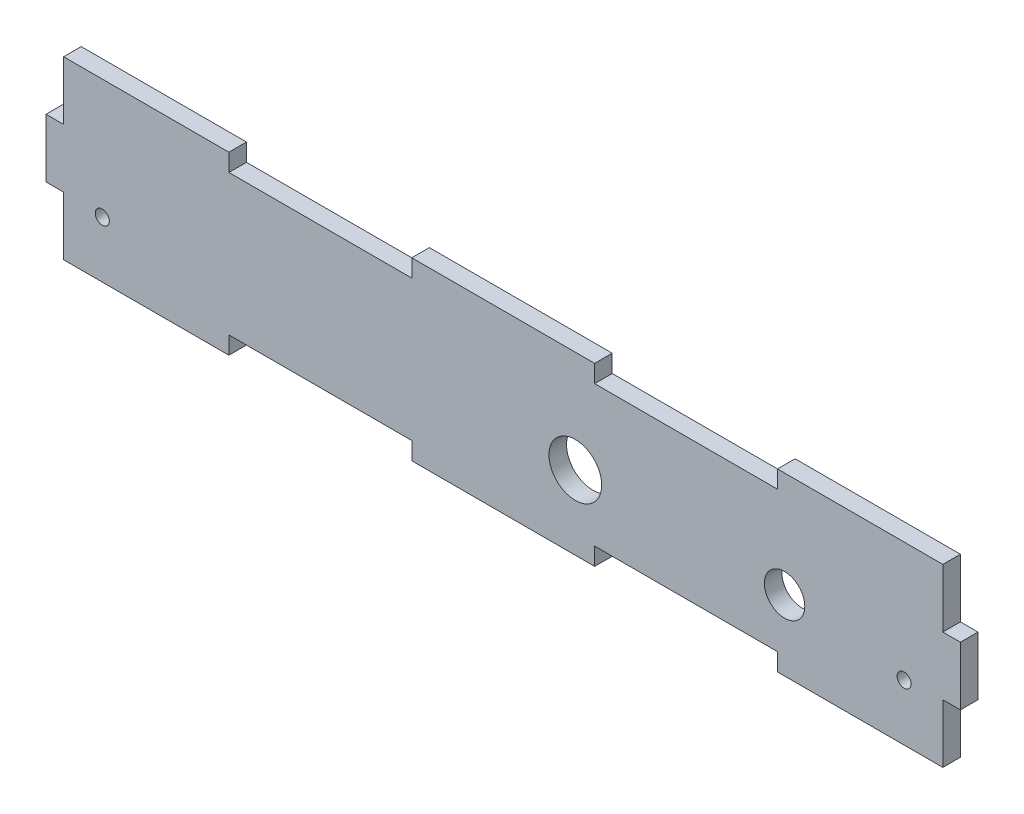
ISO-10303-21;
HEADER;
FILE_DESCRIPTION(('STEP AP214'),'2;1');
FILE_NAME('part.step','',(''),(''),'','','');
FILE_SCHEMA(('AUTOMOTIVE_DESIGN { 1 0 10303 214 1 1 1 1 }'));
ENDSEC;
DATA;
#1=APPLICATION_CONTEXT('core data for automotive mechanical design processes');
#2=APPLICATION_PROTOCOL_DEFINITION('international standard','automotive_design',2000,#1);
#3=PRODUCT_CONTEXT('',#1,'mechanical');
#4=PRODUCT('Part','Part','',(#3));
#5=PRODUCT_RELATED_PRODUCT_CATEGORY('part','',(#4));
#6=PRODUCT_DEFINITION_FORMATION('','',#4);
#7=PRODUCT_DEFINITION_CONTEXT('part definition',#1,'design');
#8=PRODUCT_DEFINITION('design','',#6,#7);
#9=PRODUCT_DEFINITION_SHAPE('','',#8);
#10=(LENGTH_UNIT() NAMED_UNIT(*) SI_UNIT(.MILLI.,.METRE.));
#11=(NAMED_UNIT(*) PLANE_ANGLE_UNIT() SI_UNIT($,.RADIAN.));
#12=(NAMED_UNIT(*) SI_UNIT($,.STERADIAN.) SOLID_ANGLE_UNIT());
#13=UNCERTAINTY_MEASURE_WITH_UNIT(LENGTH_MEASURE(1.E-05),#10,'distance_accuracy_value','');
#14=(GEOMETRIC_REPRESENTATION_CONTEXT(3) GLOBAL_UNCERTAINTY_ASSIGNED_CONTEXT((#13)) GLOBAL_UNIT_ASSIGNED_CONTEXT((#10,
#11,#12)) REPRESENTATION_CONTEXT('',''));
#15=CARTESIAN_POINT('',(0.,0.,0.));
#16=DIRECTION('',(0.,0.,1.));
#17=DIRECTION('',(1.,0.,0.));
#18=AXIS2_PLACEMENT_3D('',#15,#16,#17);
#19=CARTESIAN_POINT('',(0.,0.,5.));
#20=DIRECTION('',(0.,0.,-1.));
#21=DIRECTION('',(-1.,0.,0.));
#22=AXIS2_PLACEMENT_3D('',#19,#20,#21);
#23=PLANE('',#22);
#24=CARTESIAN_POINT('',(210.,20.,5.));
#25=DIRECTION('',(0.,0.,1.));
#26=DIRECTION('',(1.,0.,0.));
#27=AXIS2_PLACEMENT_3D('',#24,#25,#26);
#28=CIRCLE('',#27,5.75);
#29=CARTESIAN_POINT('',(215.75,20.,5.));
#30=VERTEX_POINT('',#29);
#31=EDGE_CURVE('E381',#30,#30,#28,.T.);
#32=ORIENTED_EDGE('',*,*,#31,.F.);
#33=EDGE_LOOP('',(#32));
#34=FACE_BOUND('',#33,.T.);
#35=CARTESIAN_POINT('',(150.5,21.,5.));
#36=DIRECTION('',(0.,0.,1.));
#37=DIRECTION('',(1.,0.,0.));
#38=AXIS2_PLACEMENT_3D('',#35,#36,#37);
#39=CIRCLE('',#38,7.50000000000001);
#40=CARTESIAN_POINT('',(158.,21.,5.));
#41=VERTEX_POINT('',#40);
#42=EDGE_CURVE('E387',#41,#41,#39,.T.);
#43=ORIENTED_EDGE('',*,*,#42,.F.);
#44=EDGE_LOOP('',(#43));
#45=FACE_BOUND('',#44,.T.);
#46=DIRECTION('',(0.,1.,0.));
#47=VECTOR('',#46,1.);
#48=CARTESIAN_POINT('',(52.,0.,5.));
#49=LINE('',#48,#47);
#50=CARTESIAN_POINT('',(52.,0.,5.));
#51=VERTEX_POINT('',#50);
#52=CARTESIAN_POINT('',(52.,5.,5.));
#53=VERTEX_POINT('',#52);
#54=EDGE_CURVE('E308',#51,#53,#49,.T.);
#55=ORIENTED_EDGE('',*,*,#54,.T.);
#56=DIRECTION('',(1.,0.,0.));
#57=VECTOR('',#56,1.);
#58=CARTESIAN_POINT('',(52.,5.,5.));
#59=LINE('',#58,#57);
#60=CARTESIAN_POINT('',(104.,5.,5.));
#61=VERTEX_POINT('',#60);
#62=EDGE_CURVE('E156',#53,#61,#59,.T.);
#63=ORIENTED_EDGE('',*,*,#62,.T.);
#64=DIRECTION('',(0.,-1.,0.));
#65=VECTOR('',#64,1.);
#66=CARTESIAN_POINT('',(104.,5.,5.));
#67=LINE('',#66,#65);
#68=CARTESIAN_POINT('',(104.,0.,5.));
#69=VERTEX_POINT('',#68);
#70=EDGE_CURVE('E406',#61,#69,#67,.T.);
#71=ORIENTED_EDGE('',*,*,#70,.T.);
#72=DIRECTION('',(1.,0.,0.));
#73=VECTOR('',#72,1.);
#74=CARTESIAN_POINT('',(104.,0.,5.));
#75=LINE('',#74,#73);
#76=CARTESIAN_POINT('',(156.,0.,5.));
#77=VERTEX_POINT('',#76);
#78=EDGE_CURVE('E408',#69,#77,#75,.T.);
#79=ORIENTED_EDGE('',*,*,#78,.T.);
#80=DIRECTION('',(0.,1.,0.));
#81=VECTOR('',#80,1.);
#82=CARTESIAN_POINT('',(156.,5.00000000000001,5.));
#83=LINE('',#82,#81);
#84=CARTESIAN_POINT('',(156.,5.00000000000001,5.));
#85=VERTEX_POINT('',#84);
#86=EDGE_CURVE('E410',#77,#85,#83,.T.);
#87=ORIENTED_EDGE('',*,*,#86,.T.);
#88=DIRECTION('',(1.,0.,0.));
#89=VECTOR('',#88,1.);
#90=CARTESIAN_POINT('',(208.,5.00000000000002,5.));
#91=LINE('',#90,#89);
#92=CARTESIAN_POINT('',(208.,5.00000000000002,5.));
#93=VERTEX_POINT('',#92);
#94=EDGE_CURVE('E412',#85,#93,#91,.T.);
#95=ORIENTED_EDGE('',*,*,#94,.T.);
#96=DIRECTION('',(0.,-1.,0.));
#97=VECTOR('',#96,1.);
#98=CARTESIAN_POINT('',(208.,0.,5.));
#99=LINE('',#98,#97);
#100=CARTESIAN_POINT('',(208.,0.,5.));
#101=VERTEX_POINT('',#100);
#102=EDGE_CURVE('E414',#93,#101,#99,.T.);
#103=ORIENTED_EDGE('',*,*,#102,.T.);
#104=DIRECTION('',(1.,0.,0.));
#105=VECTOR('',#104,1.);
#106=CARTESIAN_POINT('',(208.,0.,5.));
#107=LINE('',#106,#105);
#108=CARTESIAN_POINT('',(255.,0.,5.));
#109=VERTEX_POINT('',#108);
#110=EDGE_CURVE('E416',#101,#109,#107,.T.);
#111=ORIENTED_EDGE('',*,*,#110,.T.);
#112=DIRECTION('',(0.,1.,0.));
#113=VECTOR('',#112,1.);
#114=CARTESIAN_POINT('',(255.,16.6666666666667,5.));
#115=LINE('',#114,#113);
#116=CARTESIAN_POINT('',(255.,16.6666666666667,5.));
#117=VERTEX_POINT('',#116);
#118=EDGE_CURVE('E418',#109,#117,#115,.T.);
#119=ORIENTED_EDGE('',*,*,#118,.T.);
#120=DIRECTION('',(1.,0.,0.));
#121=VECTOR('',#120,1.);
#122=CARTESIAN_POINT('',(255.,16.6666666666667,5.));
#123=LINE('',#122,#121);
#124=CARTESIAN_POINT('',(260.,16.6666666666667,5.));
#125=VERTEX_POINT('',#124);
#126=EDGE_CURVE('E420',#117,#125,#123,.T.);
#127=ORIENTED_EDGE('',*,*,#126,.T.);
#128=DIRECTION('',(0.,1.,0.));
#129=VECTOR('',#128,1.);
#130=CARTESIAN_POINT('',(260.,16.6666666666667,5.));
#131=LINE('',#130,#129);
#132=CARTESIAN_POINT('',(260.,33.3333333333333,5.));
#133=VERTEX_POINT('',#132);
#134=EDGE_CURVE('E422',#125,#133,#131,.T.);
#135=ORIENTED_EDGE('',*,*,#134,.T.);
#136=DIRECTION('',(-1.,0.,0.));
#137=VECTOR('',#136,1.);
#138=CARTESIAN_POINT('',(260.,33.3333333333333,5.));
#139=LINE('',#138,#137);
#140=CARTESIAN_POINT('',(255.,33.3333333333333,5.));
#141=VERTEX_POINT('',#140);
#142=EDGE_CURVE('E424',#133,#141,#139,.T.);
#143=ORIENTED_EDGE('',*,*,#142,.T.);
#144=DIRECTION('',(0.,1.,0.));
#145=VECTOR('',#144,1.);
#146=CARTESIAN_POINT('',(255.,33.3333333333333,5.));
#147=LINE('',#146,#145);
#148=CARTESIAN_POINT('',(255.,50.,5.));
#149=VERTEX_POINT('',#148);
#150=EDGE_CURVE('E426',#141,#149,#147,.T.);
#151=ORIENTED_EDGE('',*,*,#150,.T.);
#152=DIRECTION('',(-1.,0.,0.));
#153=VECTOR('',#152,1.);
#154=CARTESIAN_POINT('',(208.,50.,5.));
#155=LINE('',#154,#153);
#156=CARTESIAN_POINT('',(208.,50.,5.));
#157=VERTEX_POINT('',#156);
#158=EDGE_CURVE('E428',#149,#157,#155,.T.);
#159=ORIENTED_EDGE('',*,*,#158,.T.);
#160=DIRECTION('',(0.,-1.,0.));
#161=VECTOR('',#160,1.);
#162=CARTESIAN_POINT('',(208.,50.,5.));
#163=LINE('',#162,#161);
#164=CARTESIAN_POINT('',(208.,45.,5.));
#165=VERTEX_POINT('',#164);
#166=EDGE_CURVE('E430',#157,#165,#163,.T.);
#167=ORIENTED_EDGE('',*,*,#166,.T.);
#168=DIRECTION('',(-1.,0.,0.));
#169=VECTOR('',#168,1.);
#170=CARTESIAN_POINT('',(208.,45.,5.));
#171=LINE('',#170,#169);
#172=CARTESIAN_POINT('',(156.,45.,5.));
#173=VERTEX_POINT('',#172);
#174=EDGE_CURVE('E432',#165,#173,#171,.T.);
#175=ORIENTED_EDGE('',*,*,#174,.T.);
#176=DIRECTION('',(0.,1.,0.));
#177=VECTOR('',#176,1.);
#178=CARTESIAN_POINT('',(156.,45.,5.));
#179=LINE('',#178,#177);
#180=CARTESIAN_POINT('',(156.,50.,5.));
#181=VERTEX_POINT('',#180);
#182=EDGE_CURVE('E434',#173,#181,#179,.T.);
#183=ORIENTED_EDGE('',*,*,#182,.T.);
#184=DIRECTION('',(-1.,0.,0.));
#185=VECTOR('',#184,1.);
#186=CARTESIAN_POINT('',(104.,50.,5.));
#187=LINE('',#186,#185);
#188=CARTESIAN_POINT('',(104.,50.,5.));
#189=VERTEX_POINT('',#188);
#190=EDGE_CURVE('E436',#181,#189,#187,.T.);
#191=ORIENTED_EDGE('',*,*,#190,.T.);
#192=DIRECTION('',(0.,-1.,0.));
#193=VECTOR('',#192,1.);
#194=CARTESIAN_POINT('',(104.,45.,5.));
#195=LINE('',#194,#193);
#196=CARTESIAN_POINT('',(104.,45.,5.));
#197=VERTEX_POINT('',#196);
#198=EDGE_CURVE('E438',#189,#197,#195,.T.);
#199=ORIENTED_EDGE('',*,*,#198,.T.);
#200=DIRECTION('',(-1.,0.,0.));
#201=VECTOR('',#200,1.);
#202=CARTESIAN_POINT('',(52.,45.,5.));
#203=LINE('',#202,#201);
#204=CARTESIAN_POINT('',(52.,45.,5.));
#205=VERTEX_POINT('',#204);
#206=EDGE_CURVE('E440',#197,#205,#203,.T.);
#207=ORIENTED_EDGE('',*,*,#206,.T.);
#208=DIRECTION('',(0.,1.,0.));
#209=VECTOR('',#208,1.);
#210=CARTESIAN_POINT('',(52.,50.,5.));
#211=LINE('',#210,#209);
#212=CARTESIAN_POINT('',(52.,50.,5.));
#213=VERTEX_POINT('',#212);
#214=EDGE_CURVE('E442',#205,#213,#211,.T.);
#215=ORIENTED_EDGE('',*,*,#214,.T.);
#216=DIRECTION('',(-1.,0.,0.));
#217=VECTOR('',#216,1.);
#218=CARTESIAN_POINT('',(5.,50.,5.));
#219=LINE('',#218,#217);
#220=CARTESIAN_POINT('',(5.,50.,5.));
#221=VERTEX_POINT('',#220);
#222=EDGE_CURVE('E444',#213,#221,#219,.T.);
#223=ORIENTED_EDGE('',*,*,#222,.T.);
#224=DIRECTION('',(0.,-1.,0.));
#225=VECTOR('',#224,1.);
#226=CARTESIAN_POINT('',(5.,33.3333333333333,5.));
#227=LINE('',#226,#225);
#228=CARTESIAN_POINT('',(5.,33.3333333333333,5.));
#229=VERTEX_POINT('',#228);
#230=EDGE_CURVE('E446',#221,#229,#227,.T.);
#231=ORIENTED_EDGE('',*,*,#230,.T.);
#232=DIRECTION('',(-1.,0.,0.));
#233=VECTOR('',#232,1.);
#234=CARTESIAN_POINT('',(0.,33.3333333333333,5.));
#235=LINE('',#234,#233);
#236=CARTESIAN_POINT('',(0.,33.3333333333333,5.));
#237=VERTEX_POINT('',#236);
#238=EDGE_CURVE('E448',#229,#237,#235,.T.);
#239=ORIENTED_EDGE('',*,*,#238,.T.);
#240=DIRECTION('',(0.,-1.,0.));
#241=VECTOR('',#240,1.);
#242=CARTESIAN_POINT('',(0.,16.6666666666667,5.));
#243=LINE('',#242,#241);
#244=CARTESIAN_POINT('',(0.,16.6666666666667,5.));
#245=VERTEX_POINT('',#244);
#246=EDGE_CURVE('E235',#237,#245,#243,.T.);
#247=ORIENTED_EDGE('',*,*,#246,.T.);
#248=DIRECTION('',(1.,0.,0.));
#249=VECTOR('',#248,1.);
#250=CARTESIAN_POINT('',(5.,16.6666666666667,5.));
#251=LINE('',#250,#249);
#252=CARTESIAN_POINT('',(5.,16.6666666666667,5.));
#253=VERTEX_POINT('',#252);
#254=EDGE_CURVE('E229',#245,#253,#251,.T.);
#255=ORIENTED_EDGE('',*,*,#254,.T.);
#256=DIRECTION('',(0.,-1.,0.));
#257=VECTOR('',#256,1.);
#258=CARTESIAN_POINT('',(5.,16.6666666666667,5.));
#259=LINE('',#258,#257);
#260=CARTESIAN_POINT('',(5.,0.,5.));
#261=VERTEX_POINT('',#260);
#262=EDGE_CURVE('E233',#253,#261,#259,.T.);
#263=ORIENTED_EDGE('',*,*,#262,.T.);
#264=DIRECTION('',(1.,0.,0.));
#265=VECTOR('',#264,1.);
#266=CARTESIAN_POINT('',(5.,0.,5.));
#267=LINE('',#266,#265);
#268=EDGE_CURVE('E53',#261,#51,#267,.T.);
#269=ORIENTED_EDGE('',*,*,#268,.T.);
#270=EDGE_LOOP('',(#55,#63,#71,#79,#87,#95,#103,#111,#119,#127,#135,#143,#151,#159,#167,#175,
#183,#191,#199,#207,#215,#223,#231,#239,#247,#255,#263,#269));
#271=FACE_BOUND('',#270,.T.);
#272=CARTESIAN_POINT('',(16.,16.,5.));
#273=DIRECTION('',(0.,0.,1.));
#274=DIRECTION('',(1.,0.,0.));
#275=AXIS2_PLACEMENT_3D('',#272,#273,#274);
#276=CIRCLE('',#275,2.);
#277=CARTESIAN_POINT('',(18.,16.,5.));
#278=VERTEX_POINT('',#277);
#279=EDGE_CURVE('E257',#278,#278,#276,.T.);
#280=ORIENTED_EDGE('',*,*,#279,.F.);
#281=EDGE_LOOP('',(#280));
#282=FACE_BOUND('',#281,.T.);
#283=CARTESIAN_POINT('',(244.,16.,5.));
#284=DIRECTION('',(0.,0.,1.));
#285=DIRECTION('',(-1.,0.,0.));
#286=AXIS2_PLACEMENT_3D('',#283,#284,#285);
#287=CIRCLE('',#286,2.);
#288=CARTESIAN_POINT('',(242.,16.,5.));
#289=VERTEX_POINT('',#288);
#290=EDGE_CURVE('E394',#289,#289,#287,.T.);
#291=ORIENTED_EDGE('',*,*,#290,.F.);
#292=EDGE_LOOP('',(#291));
#293=FACE_BOUND('',#292,.T.);
#294=ADVANCED_FACE('F34',(#34,#45,#271,#282,#293),#23,.F.);
#295=CARTESIAN_POINT('',(0.,0.,0.));
#296=DIRECTION('',(0.,0.,-1.));
#297=DIRECTION('',(-1.,0.,0.));
#298=AXIS2_PLACEMENT_3D('',#295,#296,#297);
#299=PLANE('',#298);
#300=CARTESIAN_POINT('',(210.,20.,0.));
#301=DIRECTION('',(0.,0.,-1.));
#302=DIRECTION('',(-1.,0.,0.));
#303=AXIS2_PLACEMENT_3D('',#300,#301,#302);
#304=CIRCLE('',#303,5.75);
#305=CARTESIAN_POINT('',(204.25,20.,0.));
#306=VERTEX_POINT('',#305);
#307=EDGE_CURVE('E38',#306,#306,#304,.T.);
#308=ORIENTED_EDGE('',*,*,#307,.F.);
#309=EDGE_LOOP('',(#308));
#310=FACE_BOUND('',#309,.T.);
#311=CARTESIAN_POINT('',(150.5,21.,0.));
#312=DIRECTION('',(0.,0.,-1.));
#313=DIRECTION('',(-1.,0.,0.));
#314=AXIS2_PLACEMENT_3D('',#311,#312,#313);
#315=CIRCLE('',#314,7.50000000000001);
#316=CARTESIAN_POINT('',(143.,21.,0.));
#317=VERTEX_POINT('',#316);
#318=EDGE_CURVE('E379',#317,#317,#315,.T.);
#319=ORIENTED_EDGE('',*,*,#318,.F.);
#320=EDGE_LOOP('',(#319));
#321=FACE_BOUND('',#320,.T.);
#322=CARTESIAN_POINT('',(16.,16.,0.));
#323=DIRECTION('',(0.,0.,1.));
#324=DIRECTION('',(1.,0.,0.));
#325=AXIS2_PLACEMENT_3D('',#322,#323,#324);
#326=CIRCLE('',#325,2.);
#327=CARTESIAN_POINT('',(18.,16.,0.));
#328=VERTEX_POINT('',#327);
#329=EDGE_CURVE('E397',#328,#328,#326,.T.);
#330=ORIENTED_EDGE('',*,*,#329,.T.);
#331=EDGE_LOOP('',(#330));
#332=FACE_BOUND('',#331,.T.);
#333=DIRECTION('',(0.,1.,0.));
#334=VECTOR('',#333,1.);
#335=CARTESIAN_POINT('',(52.,0.,0.));
#336=LINE('',#335,#334);
#337=CARTESIAN_POINT('',(52.,0.,0.));
#338=VERTEX_POINT('',#337);
#339=CARTESIAN_POINT('',(52.,5.,0.));
#340=VERTEX_POINT('',#339);
#341=EDGE_CURVE('E253',#338,#340,#336,.T.);
#342=ORIENTED_EDGE('',*,*,#341,.F.);
#343=DIRECTION('',(1.,0.,0.));
#344=VECTOR('',#343,1.);
#345=CARTESIAN_POINT('',(5.,0.,0.));
#346=LINE('',#345,#344);
#347=CARTESIAN_POINT('',(5.,0.,0.));
#348=VERTEX_POINT('',#347);
#349=EDGE_CURVE('E148',#348,#338,#346,.T.);
#350=ORIENTED_EDGE('',*,*,#349,.F.);
#351=DIRECTION('',(0.,-1.,0.));
#352=VECTOR('',#351,1.);
#353=CARTESIAN_POINT('',(5.,16.6666666666667,0.));
#354=LINE('',#353,#352);
#355=CARTESIAN_POINT('',(5.,16.6666666666667,0.));
#356=VERTEX_POINT('',#355);
#357=EDGE_CURVE('E142',#356,#348,#354,.T.);
#358=ORIENTED_EDGE('',*,*,#357,.F.);
#359=DIRECTION('',(1.,0.,0.));
#360=VECTOR('',#359,1.);
#361=CARTESIAN_POINT('',(5.,16.6666666666667,0.));
#362=LINE('',#361,#360);
#363=CARTESIAN_POINT('',(0.,16.6666666666667,0.));
#364=VERTEX_POINT('',#363);
#365=EDGE_CURVE('E243',#364,#356,#362,.T.);
#366=ORIENTED_EDGE('',*,*,#365,.F.);
#367=DIRECTION('',(0.,-1.,0.));
#368=VECTOR('',#367,1.);
#369=CARTESIAN_POINT('',(0.,16.6666666666667,0.));
#370=LINE('',#369,#368);
#371=CARTESIAN_POINT('',(0.,33.3333333333333,0.));
#372=VERTEX_POINT('',#371);
#373=EDGE_CURVE('E303',#372,#364,#370,.T.);
#374=ORIENTED_EDGE('',*,*,#373,.F.);
#375=DIRECTION('',(-1.,0.,0.));
#376=VECTOR('',#375,1.);
#377=CARTESIAN_POINT('',(0.,33.3333333333333,0.));
#378=LINE('',#377,#376);
#379=CARTESIAN_POINT('',(5.,33.3333333333333,0.));
#380=VERTEX_POINT('',#379);
#381=EDGE_CURVE('E301',#380,#372,#378,.T.);
#382=ORIENTED_EDGE('',*,*,#381,.F.);
#383=DIRECTION('',(0.,-1.,0.));
#384=VECTOR('',#383,1.);
#385=CARTESIAN_POINT('',(5.,33.3333333333333,0.));
#386=LINE('',#385,#384);
#387=CARTESIAN_POINT('',(5.,50.,0.));
#388=VERTEX_POINT('',#387);
#389=EDGE_CURVE('E299',#388,#380,#386,.T.);
#390=ORIENTED_EDGE('',*,*,#389,.F.);
#391=DIRECTION('',(-1.,0.,0.));
#392=VECTOR('',#391,1.);
#393=CARTESIAN_POINT('',(5.,50.,0.));
#394=LINE('',#393,#392);
#395=CARTESIAN_POINT('',(52.,50.,0.));
#396=VERTEX_POINT('',#395);
#397=EDGE_CURVE('E297',#396,#388,#394,.T.);
#398=ORIENTED_EDGE('',*,*,#397,.F.);
#399=DIRECTION('',(0.,1.,0.));
#400=VECTOR('',#399,1.);
#401=CARTESIAN_POINT('',(52.,50.,0.));
#402=LINE('',#401,#400);
#403=CARTESIAN_POINT('',(52.,45.,0.));
#404=VERTEX_POINT('',#403);
#405=EDGE_CURVE('E295',#404,#396,#402,.T.);
#406=ORIENTED_EDGE('',*,*,#405,.F.);
#407=DIRECTION('',(-1.,0.,0.));
#408=VECTOR('',#407,1.);
#409=CARTESIAN_POINT('',(52.,45.,0.));
#410=LINE('',#409,#408);
#411=CARTESIAN_POINT('',(104.,45.,0.));
#412=VERTEX_POINT('',#411);
#413=EDGE_CURVE('E293',#412,#404,#410,.T.);
#414=ORIENTED_EDGE('',*,*,#413,.F.);
#415=DIRECTION('',(0.,-1.,0.));
#416=VECTOR('',#415,1.);
#417=CARTESIAN_POINT('',(104.,45.,0.));
#418=LINE('',#417,#416);
#419=CARTESIAN_POINT('',(104.,50.,0.));
#420=VERTEX_POINT('',#419);
#421=EDGE_CURVE('E291',#420,#412,#418,.T.);
#422=ORIENTED_EDGE('',*,*,#421,.F.);
#423=DIRECTION('',(-1.,0.,0.));
#424=VECTOR('',#423,1.);
#425=CARTESIAN_POINT('',(104.,50.,0.));
#426=LINE('',#425,#424);
#427=CARTESIAN_POINT('',(156.,50.,0.));
#428=VERTEX_POINT('',#427);
#429=EDGE_CURVE('E289',#428,#420,#426,.T.);
#430=ORIENTED_EDGE('',*,*,#429,.F.);
#431=DIRECTION('',(0.,1.,0.));
#432=VECTOR('',#431,1.);
#433=CARTESIAN_POINT('',(156.,45.,0.));
#434=LINE('',#433,#432);
#435=CARTESIAN_POINT('',(156.,45.,0.));
#436=VERTEX_POINT('',#435);
#437=EDGE_CURVE('E287',#436,#428,#434,.T.);
#438=ORIENTED_EDGE('',*,*,#437,.F.);
#439=DIRECTION('',(-1.,0.,0.));
#440=VECTOR('',#439,1.);
#441=CARTESIAN_POINT('',(208.,45.,0.));
#442=LINE('',#441,#440);
#443=CARTESIAN_POINT('',(208.,45.,0.));
#444=VERTEX_POINT('',#443);
#445=EDGE_CURVE('E285',#444,#436,#442,.T.);
#446=ORIENTED_EDGE('',*,*,#445,.F.);
#447=DIRECTION('',(0.,-1.,0.));
#448=VECTOR('',#447,1.);
#449=CARTESIAN_POINT('',(208.,50.,0.));
#450=LINE('',#449,#448);
#451=CARTESIAN_POINT('',(208.,50.,0.));
#452=VERTEX_POINT('',#451);
#453=EDGE_CURVE('E283',#452,#444,#450,.T.);
#454=ORIENTED_EDGE('',*,*,#453,.F.);
#455=DIRECTION('',(-1.,0.,0.));
#456=VECTOR('',#455,1.);
#457=CARTESIAN_POINT('',(208.,50.,0.));
#458=LINE('',#457,#456);
#459=CARTESIAN_POINT('',(255.,50.,0.));
#460=VERTEX_POINT('',#459);
#461=EDGE_CURVE('E281',#460,#452,#458,.T.);
#462=ORIENTED_EDGE('',*,*,#461,.F.);
#463=DIRECTION('',(0.,1.,0.));
#464=VECTOR('',#463,1.);
#465=CARTESIAN_POINT('',(255.,33.3333333333333,0.));
#466=LINE('',#465,#464);
#467=CARTESIAN_POINT('',(255.,33.3333333333333,0.));
#468=VERTEX_POINT('',#467);
#469=EDGE_CURVE('E279',#468,#460,#466,.T.);
#470=ORIENTED_EDGE('',*,*,#469,.F.);
#471=DIRECTION('',(-1.,0.,0.));
#472=VECTOR('',#471,1.);
#473=CARTESIAN_POINT('',(260.,33.3333333333333,0.));
#474=LINE('',#473,#472);
#475=CARTESIAN_POINT('',(260.,33.3333333333333,0.));
#476=VERTEX_POINT('',#475);
#477=EDGE_CURVE('E277',#476,#468,#474,.T.);
#478=ORIENTED_EDGE('',*,*,#477,.F.);
#479=DIRECTION('',(0.,1.,0.));
#480=VECTOR('',#479,1.);
#481=CARTESIAN_POINT('',(260.,16.6666666666667,0.));
#482=LINE('',#481,#480);
#483=CARTESIAN_POINT('',(260.,16.6666666666667,0.));
#484=VERTEX_POINT('',#483);
#485=EDGE_CURVE('E275',#484,#476,#482,.T.);
#486=ORIENTED_EDGE('',*,*,#485,.F.);
#487=DIRECTION('',(1.,0.,0.));
#488=VECTOR('',#487,1.);
#489=CARTESIAN_POINT('',(255.,16.6666666666667,0.));
#490=LINE('',#489,#488);
#491=CARTESIAN_POINT('',(255.,16.6666666666667,0.));
#492=VERTEX_POINT('',#491);
#493=EDGE_CURVE('E273',#492,#484,#490,.T.);
#494=ORIENTED_EDGE('',*,*,#493,.F.);
#495=DIRECTION('',(0.,1.,0.));
#496=VECTOR('',#495,1.);
#497=CARTESIAN_POINT('',(255.,16.6666666666667,0.));
#498=LINE('',#497,#496);
#499=CARTESIAN_POINT('',(255.,0.,0.));
#500=VERTEX_POINT('',#499);
#501=EDGE_CURVE('E271',#500,#492,#498,.T.);
#502=ORIENTED_EDGE('',*,*,#501,.F.);
#503=DIRECTION('',(1.,0.,0.));
#504=VECTOR('',#503,1.);
#505=CARTESIAN_POINT('',(208.,0.,0.));
#506=LINE('',#505,#504);
#507=CARTESIAN_POINT('',(208.,0.,0.));
#508=VERTEX_POINT('',#507);
#509=EDGE_CURVE('E269',#508,#500,#506,.T.);
#510=ORIENTED_EDGE('',*,*,#509,.F.);
#511=DIRECTION('',(0.,-1.,0.));
#512=VECTOR('',#511,1.);
#513=CARTESIAN_POINT('',(208.,0.,0.));
#514=LINE('',#513,#512);
#515=CARTESIAN_POINT('',(208.,5.00000000000002,0.));
#516=VERTEX_POINT('',#515);
#517=EDGE_CURVE('E267',#516,#508,#514,.T.);
#518=ORIENTED_EDGE('',*,*,#517,.F.);
#519=DIRECTION('',(1.,0.,0.));
#520=VECTOR('',#519,1.);
#521=CARTESIAN_POINT('',(208.,5.00000000000002,0.));
#522=LINE('',#521,#520);
#523=CARTESIAN_POINT('',(156.,5.00000000000001,0.));
#524=VERTEX_POINT('',#523);
#525=EDGE_CURVE('E265',#524,#516,#522,.T.);
#526=ORIENTED_EDGE('',*,*,#525,.F.);
#527=DIRECTION('',(0.,1.,0.));
#528=VECTOR('',#527,1.);
#529=CARTESIAN_POINT('',(156.,5.00000000000001,0.));
#530=LINE('',#529,#528);
#531=CARTESIAN_POINT('',(156.,0.,0.));
#532=VERTEX_POINT('',#531);
#533=EDGE_CURVE('E263',#532,#524,#530,.T.);
#534=ORIENTED_EDGE('',*,*,#533,.F.);
#535=DIRECTION('',(1.,0.,0.));
#536=VECTOR('',#535,1.);
#537=CARTESIAN_POINT('',(104.,0.,0.));
#538=LINE('',#537,#536);
#539=CARTESIAN_POINT('',(104.,0.,0.));
#540=VERTEX_POINT('',#539);
#541=EDGE_CURVE('E261',#540,#532,#538,.T.);
#542=ORIENTED_EDGE('',*,*,#541,.F.);
#543=DIRECTION('',(0.,-1.,0.));
#544=VECTOR('',#543,1.);
#545=CARTESIAN_POINT('',(104.,5.,0.));
#546=LINE('',#545,#544);
#547=CARTESIAN_POINT('',(104.,5.,0.));
#548=VERTEX_POINT('',#547);
#549=EDGE_CURVE('E259',#548,#540,#546,.T.);
#550=ORIENTED_EDGE('',*,*,#549,.F.);
#551=DIRECTION('',(1.,0.,0.));
#552=VECTOR('',#551,1.);
#553=CARTESIAN_POINT('',(52.,5.,0.));
#554=LINE('',#553,#552);
#555=EDGE_CURVE('E256',#340,#548,#554,.T.);
#556=ORIENTED_EDGE('',*,*,#555,.F.);
#557=EDGE_LOOP('',(#342,#350,#358,#366,#374,#382,#390,#398,#406,#414,#422,#430,#438,#446,#454,
#462,#470,#478,#486,#494,#502,#510,#518,#526,#534,#542,#550,#556));
#558=FACE_BOUND('',#557,.T.);
#559=CARTESIAN_POINT('',(244.,16.,0.));
#560=DIRECTION('',(0.,0.,1.));
#561=DIRECTION('',(-1.,0.,0.));
#562=AXIS2_PLACEMENT_3D('',#559,#560,#561);
#563=CIRCLE('',#562,2.);
#564=CARTESIAN_POINT('',(242.,16.,0.));
#565=VERTEX_POINT('',#564);
#566=EDGE_CURVE('E385',#565,#565,#563,.T.);
#567=ORIENTED_EDGE('',*,*,#566,.T.);
#568=EDGE_LOOP('',(#567));
#569=FACE_BOUND('',#568,.T.);
#570=ADVANCED_FACE('F461',(#310,#321,#332,#558,#569),#299,.T.);
#571=CARTESIAN_POINT('',(52.,0.,5.));
#572=DIRECTION('',(-1.,0.,0.));
#573=DIRECTION('',(0.,0.,1.));
#574=AXIS2_PLACEMENT_3D('',#571,#572,#573);
#575=PLANE('',#574);
#576=ORIENTED_EDGE('',*,*,#341,.T.);
#577=DIRECTION('',(0.,0.,-1.));
#578=VECTOR('',#577,1.);
#579=CARTESIAN_POINT('',(52.,5.,5.));
#580=LINE('',#579,#578);
#581=EDGE_CURVE('E11',#53,#340,#580,.T.);
#582=ORIENTED_EDGE('',*,*,#581,.F.);
#583=ORIENTED_EDGE('',*,*,#54,.F.);
#584=DIRECTION('',(0.,0.,-1.));
#585=VECTOR('',#584,1.);
#586=CARTESIAN_POINT('',(52.,0.,5.));
#587=LINE('',#586,#585);
#588=EDGE_CURVE('E249',#51,#338,#587,.T.);
#589=ORIENTED_EDGE('',*,*,#588,.T.);
#590=EDGE_LOOP('',(#576,#582,#583,#589));
#591=FACE_BOUND('',#590,.T.);
#592=ADVANCED_FACE('F36',(#591),#575,.F.);
#593=CARTESIAN_POINT('',(52.,5.,5.));
#594=DIRECTION('',(0.,1.,0.));
#595=DIRECTION('',(-1.,0.,0.));
#596=AXIS2_PLACEMENT_3D('',#593,#594,#595);
#597=PLANE('',#596);
#598=ORIENTED_EDGE('',*,*,#555,.T.);
#599=DIRECTION('',(0.,0.,-1.));
#600=VECTOR('',#599,1.);
#601=CARTESIAN_POINT('',(104.,5.,5.));
#602=LINE('',#601,#600);
#603=EDGE_CURVE('E44',#61,#548,#602,.T.);
#604=ORIENTED_EDGE('',*,*,#603,.F.);
#605=ORIENTED_EDGE('',*,*,#62,.F.);
#606=ORIENTED_EDGE('',*,*,#581,.T.);
#607=EDGE_LOOP('',(#598,#604,#605,#606));
#608=FACE_BOUND('',#607,.T.);
#609=ADVANCED_FACE('F761',(#608),#597,.F.);
#610=CARTESIAN_POINT('',(104.,5.,5.));
#611=DIRECTION('',(1.,0.,0.));
#612=DIRECTION('',(0.,0.,-1.));
#613=AXIS2_PLACEMENT_3D('',#610,#611,#612);
#614=PLANE('',#613);
#615=ORIENTED_EDGE('',*,*,#549,.T.);
#616=DIRECTION('',(0.,0.,-1.));
#617=VECTOR('',#616,1.);
#618=CARTESIAN_POINT('',(104.,0.,5.));
#619=LINE('',#618,#617);
#620=EDGE_CURVE('E375',#69,#540,#619,.T.);
#621=ORIENTED_EDGE('',*,*,#620,.F.);
#622=ORIENTED_EDGE('',*,*,#70,.F.);
#623=ORIENTED_EDGE('',*,*,#603,.T.);
#624=EDGE_LOOP('',(#615,#621,#622,#623));
#625=FACE_BOUND('',#624,.T.);
#626=ADVANCED_FACE('F751',(#625),#614,.F.);
#627=CARTESIAN_POINT('',(104.,0.,5.));
#628=DIRECTION('',(0.,1.,0.));
#629=DIRECTION('',(-1.,0.,0.));
#630=AXIS2_PLACEMENT_3D('',#627,#628,#629);
#631=PLANE('',#630);
#632=ORIENTED_EDGE('',*,*,#541,.T.);
#633=DIRECTION('',(0.,0.,-1.));
#634=VECTOR('',#633,1.);
#635=CARTESIAN_POINT('',(156.,0.,5.));
#636=LINE('',#635,#634);
#637=EDGE_CURVE('E372',#77,#532,#636,.T.);
#638=ORIENTED_EDGE('',*,*,#637,.F.);
#639=ORIENTED_EDGE('',*,*,#78,.F.);
#640=ORIENTED_EDGE('',*,*,#620,.T.);
#641=EDGE_LOOP('',(#632,#638,#639,#640));
#642=FACE_BOUND('',#641,.T.);
#643=ADVANCED_FACE('F741',(#642),#631,.F.);
#644=CARTESIAN_POINT('',(156.,5.00000000000001,5.));
#645=DIRECTION('',(-1.,0.,0.));
#646=DIRECTION('',(0.,0.,1.));
#647=AXIS2_PLACEMENT_3D('',#644,#645,#646);
#648=PLANE('',#647);
#649=ORIENTED_EDGE('',*,*,#533,.T.);
#650=DIRECTION('',(0.,0.,-1.));
#651=VECTOR('',#650,1.);
#652=CARTESIAN_POINT('',(156.,5.00000000000001,5.));
#653=LINE('',#652,#651);
#654=EDGE_CURVE('E369',#85,#524,#653,.T.);
#655=ORIENTED_EDGE('',*,*,#654,.F.);
#656=ORIENTED_EDGE('',*,*,#86,.F.);
#657=ORIENTED_EDGE('',*,*,#637,.T.);
#658=EDGE_LOOP('',(#649,#655,#656,#657));
#659=FACE_BOUND('',#658,.T.);
#660=ADVANCED_FACE('F731',(#659),#648,.F.);
#661=CARTESIAN_POINT('',(208.,5.00000000000002,5.));
#662=DIRECTION('',(0.,1.,0.));
#663=DIRECTION('',(-1.,0.,0.));
#664=AXIS2_PLACEMENT_3D('',#661,#662,#663);
#665=PLANE('',#664);
#666=ORIENTED_EDGE('',*,*,#525,.T.);
#667=DIRECTION('',(0.,0.,-1.));
#668=VECTOR('',#667,1.);
#669=CARTESIAN_POINT('',(208.,5.00000000000002,5.));
#670=LINE('',#669,#668);
#671=EDGE_CURVE('E366',#93,#516,#670,.T.);
#672=ORIENTED_EDGE('',*,*,#671,.F.);
#673=ORIENTED_EDGE('',*,*,#94,.F.);
#674=ORIENTED_EDGE('',*,*,#654,.T.);
#675=EDGE_LOOP('',(#666,#672,#673,#674));
#676=FACE_BOUND('',#675,.T.);
#677=ADVANCED_FACE('F721',(#676),#665,.F.);
#678=CARTESIAN_POINT('',(208.,0.,5.));
#679=DIRECTION('',(1.,0.,0.));
#680=DIRECTION('',(0.,0.,-1.));
#681=AXIS2_PLACEMENT_3D('',#678,#679,#680);
#682=PLANE('',#681);
#683=ORIENTED_EDGE('',*,*,#517,.T.);
#684=DIRECTION('',(0.,0.,-1.));
#685=VECTOR('',#684,1.);
#686=CARTESIAN_POINT('',(208.,0.,5.));
#687=LINE('',#686,#685);
#688=EDGE_CURVE('E363',#101,#508,#687,.T.);
#689=ORIENTED_EDGE('',*,*,#688,.F.);
#690=ORIENTED_EDGE('',*,*,#102,.F.);
#691=ORIENTED_EDGE('',*,*,#671,.T.);
#692=EDGE_LOOP('',(#683,#689,#690,#691));
#693=FACE_BOUND('',#692,.T.);
#694=ADVANCED_FACE('F711',(#693),#682,.F.);
#695=CARTESIAN_POINT('',(208.,0.,5.));
#696=DIRECTION('',(0.,1.,0.));
#697=DIRECTION('',(-1.,0.,0.));
#698=AXIS2_PLACEMENT_3D('',#695,#696,#697);
#699=PLANE('',#698);
#700=ORIENTED_EDGE('',*,*,#509,.T.);
#701=DIRECTION('',(0.,0.,-1.));
#702=VECTOR('',#701,1.);
#703=CARTESIAN_POINT('',(255.,0.,5.));
#704=LINE('',#703,#702);
#705=EDGE_CURVE('E360',#109,#500,#704,.T.);
#706=ORIENTED_EDGE('',*,*,#705,.F.);
#707=ORIENTED_EDGE('',*,*,#110,.F.);
#708=ORIENTED_EDGE('',*,*,#688,.T.);
#709=EDGE_LOOP('',(#700,#706,#707,#708));
#710=FACE_BOUND('',#709,.T.);
#711=ADVANCED_FACE('F701',(#710),#699,.F.);
#712=CARTESIAN_POINT('',(255.,16.6666666666667,5.));
#713=DIRECTION('',(-1.,0.,0.));
#714=DIRECTION('',(0.,0.,1.));
#715=AXIS2_PLACEMENT_3D('',#712,#713,#714);
#716=PLANE('',#715);
#717=ORIENTED_EDGE('',*,*,#501,.T.);
#718=DIRECTION('',(0.,0.,-1.));
#719=VECTOR('',#718,1.);
#720=CARTESIAN_POINT('',(255.,16.6666666666667,5.));
#721=LINE('',#720,#719);
#722=EDGE_CURVE('E357',#117,#492,#721,.T.);
#723=ORIENTED_EDGE('',*,*,#722,.F.);
#724=ORIENTED_EDGE('',*,*,#118,.F.);
#725=ORIENTED_EDGE('',*,*,#705,.T.);
#726=EDGE_LOOP('',(#717,#723,#724,#725));
#727=FACE_BOUND('',#726,.T.);
#728=ADVANCED_FACE('F691',(#727),#716,.F.);
#729=CARTESIAN_POINT('',(255.,16.6666666666667,5.));
#730=DIRECTION('',(0.,1.,0.));
#731=DIRECTION('',(0.,0.,1.));
#732=AXIS2_PLACEMENT_3D('',#729,#730,#731);
#733=PLANE('',#732);
#734=ORIENTED_EDGE('',*,*,#493,.T.);
#735=DIRECTION('',(0.,0.,-1.));
#736=VECTOR('',#735,1.);
#737=CARTESIAN_POINT('',(260.,16.6666666666667,5.));
#738=LINE('',#737,#736);
#739=EDGE_CURVE('E354',#125,#484,#738,.T.);
#740=ORIENTED_EDGE('',*,*,#739,.F.);
#741=ORIENTED_EDGE('',*,*,#126,.F.);
#742=ORIENTED_EDGE('',*,*,#722,.T.);
#743=EDGE_LOOP('',(#734,#740,#741,#742));
#744=FACE_BOUND('',#743,.T.);
#745=ADVANCED_FACE('F681',(#744),#733,.F.);
#746=CARTESIAN_POINT('',(260.,16.6666666666667,5.));
#747=DIRECTION('',(-1.,0.,0.));
#748=DIRECTION('',(0.,0.,1.));
#749=AXIS2_PLACEMENT_3D('',#746,#747,#748);
#750=PLANE('',#749);
#751=ORIENTED_EDGE('',*,*,#485,.T.);
#752=DIRECTION('',(0.,0.,-1.));
#753=VECTOR('',#752,1.);
#754=CARTESIAN_POINT('',(260.,33.3333333333333,5.));
#755=LINE('',#754,#753);
#756=EDGE_CURVE('E351',#133,#476,#755,.T.);
#757=ORIENTED_EDGE('',*,*,#756,.F.);
#758=ORIENTED_EDGE('',*,*,#134,.F.);
#759=ORIENTED_EDGE('',*,*,#739,.T.);
#760=EDGE_LOOP('',(#751,#757,#758,#759));
#761=FACE_BOUND('',#760,.T.);
#762=ADVANCED_FACE('F671',(#761),#750,.F.);
#763=CARTESIAN_POINT('',(260.,33.3333333333333,5.));
#764=DIRECTION('',(0.,-1.,0.));
#765=DIRECTION('',(0.,0.,-1.));
#766=AXIS2_PLACEMENT_3D('',#763,#764,#765);
#767=PLANE('',#766);
#768=ORIENTED_EDGE('',*,*,#477,.T.);
#769=DIRECTION('',(0.,0.,-1.));
#770=VECTOR('',#769,1.);
#771=CARTESIAN_POINT('',(255.,33.3333333333333,5.));
#772=LINE('',#771,#770);
#773=EDGE_CURVE('E348',#141,#468,#772,.T.);
#774=ORIENTED_EDGE('',*,*,#773,.F.);
#775=ORIENTED_EDGE('',*,*,#142,.F.);
#776=ORIENTED_EDGE('',*,*,#756,.T.);
#777=EDGE_LOOP('',(#768,#774,#775,#776));
#778=FACE_BOUND('',#777,.T.);
#779=ADVANCED_FACE('F661',(#778),#767,.F.);
#780=CARTESIAN_POINT('',(255.,33.3333333333333,5.));
#781=DIRECTION('',(-1.,0.,0.));
#782=DIRECTION('',(0.,0.,1.));
#783=AXIS2_PLACEMENT_3D('',#780,#781,#782);
#784=PLANE('',#783);
#785=ORIENTED_EDGE('',*,*,#469,.T.);
#786=DIRECTION('',(0.,0.,-1.));
#787=VECTOR('',#786,1.);
#788=CARTESIAN_POINT('',(255.,50.,5.));
#789=LINE('',#788,#787);
#790=EDGE_CURVE('E345',#149,#460,#789,.T.);
#791=ORIENTED_EDGE('',*,*,#790,.F.);
#792=ORIENTED_EDGE('',*,*,#150,.F.);
#793=ORIENTED_EDGE('',*,*,#773,.T.);
#794=EDGE_LOOP('',(#785,#791,#792,#793));
#795=FACE_BOUND('',#794,.T.);
#796=ADVANCED_FACE('F651',(#795),#784,.F.);
#797=CARTESIAN_POINT('',(208.,50.,5.));
#798=DIRECTION('',(0.,-1.,0.));
#799=DIRECTION('',(1.,0.,0.));
#800=AXIS2_PLACEMENT_3D('',#797,#798,#799);
#801=PLANE('',#800);
#802=ORIENTED_EDGE('',*,*,#461,.T.);
#803=DIRECTION('',(0.,0.,-1.));
#804=VECTOR('',#803,1.);
#805=CARTESIAN_POINT('',(208.,50.,5.));
#806=LINE('',#805,#804);
#807=EDGE_CURVE('E342',#157,#452,#806,.T.);
#808=ORIENTED_EDGE('',*,*,#807,.F.);
#809=ORIENTED_EDGE('',*,*,#158,.F.);
#810=ORIENTED_EDGE('',*,*,#790,.T.);
#811=EDGE_LOOP('',(#802,#808,#809,#810));
#812=FACE_BOUND('',#811,.T.);
#813=ADVANCED_FACE('F641',(#812),#801,.F.);
#814=CARTESIAN_POINT('',(208.,50.,5.));
#815=DIRECTION('',(1.,0.,0.));
#816=DIRECTION('',(0.,0.,-1.));
#817=AXIS2_PLACEMENT_3D('',#814,#815,#816);
#818=PLANE('',#817);
#819=ORIENTED_EDGE('',*,*,#453,.T.);
#820=DIRECTION('',(0.,0.,-1.));
#821=VECTOR('',#820,1.);
#822=CARTESIAN_POINT('',(208.,45.,5.));
#823=LINE('',#822,#821);
#824=EDGE_CURVE('E339',#165,#444,#823,.T.);
#825=ORIENTED_EDGE('',*,*,#824,.F.);
#826=ORIENTED_EDGE('',*,*,#166,.F.);
#827=ORIENTED_EDGE('',*,*,#807,.T.);
#828=EDGE_LOOP('',(#819,#825,#826,#827));
#829=FACE_BOUND('',#828,.T.);
#830=ADVANCED_FACE('F631',(#829),#818,.F.);
#831=CARTESIAN_POINT('',(208.,45.,5.));
#832=DIRECTION('',(0.,-1.,0.));
#833=DIRECTION('',(1.,0.,0.));
#834=AXIS2_PLACEMENT_3D('',#831,#832,#833);
#835=PLANE('',#834);
#836=ORIENTED_EDGE('',*,*,#445,.T.);
#837=DIRECTION('',(0.,0.,-1.));
#838=VECTOR('',#837,1.);
#839=CARTESIAN_POINT('',(156.,45.,5.));
#840=LINE('',#839,#838);
#841=EDGE_CURVE('E336',#173,#436,#840,.T.);
#842=ORIENTED_EDGE('',*,*,#841,.F.);
#843=ORIENTED_EDGE('',*,*,#174,.F.);
#844=ORIENTED_EDGE('',*,*,#824,.T.);
#845=EDGE_LOOP('',(#836,#842,#843,#844));
#846=FACE_BOUND('',#845,.T.);
#847=ADVANCED_FACE('F621',(#846),#835,.F.);
#848=CARTESIAN_POINT('',(156.,45.,5.));
#849=DIRECTION('',(-1.,0.,0.));
#850=DIRECTION('',(0.,0.,1.));
#851=AXIS2_PLACEMENT_3D('',#848,#849,#850);
#852=PLANE('',#851);
#853=ORIENTED_EDGE('',*,*,#437,.T.);
#854=DIRECTION('',(0.,0.,-1.));
#855=VECTOR('',#854,1.);
#856=CARTESIAN_POINT('',(156.,50.,5.));
#857=LINE('',#856,#855);
#858=EDGE_CURVE('E333',#181,#428,#857,.T.);
#859=ORIENTED_EDGE('',*,*,#858,.F.);
#860=ORIENTED_EDGE('',*,*,#182,.F.);
#861=ORIENTED_EDGE('',*,*,#841,.T.);
#862=EDGE_LOOP('',(#853,#859,#860,#861));
#863=FACE_BOUND('',#862,.T.);
#864=ADVANCED_FACE('F611',(#863),#852,.F.);
#865=CARTESIAN_POINT('',(104.,50.,5.));
#866=DIRECTION('',(0.,-1.,0.));
#867=DIRECTION('',(1.,0.,0.));
#868=AXIS2_PLACEMENT_3D('',#865,#866,#867);
#869=PLANE('',#868);
#870=ORIENTED_EDGE('',*,*,#429,.T.);
#871=DIRECTION('',(0.,0.,-1.));
#872=VECTOR('',#871,1.);
#873=CARTESIAN_POINT('',(104.,50.,5.));
#874=LINE('',#873,#872);
#875=EDGE_CURVE('E330',#189,#420,#874,.T.);
#876=ORIENTED_EDGE('',*,*,#875,.F.);
#877=ORIENTED_EDGE('',*,*,#190,.F.);
#878=ORIENTED_EDGE('',*,*,#858,.T.);
#879=EDGE_LOOP('',(#870,#876,#877,#878));
#880=FACE_BOUND('',#879,.T.);
#881=ADVANCED_FACE('F601',(#880),#869,.F.);
#882=CARTESIAN_POINT('',(104.,45.,5.));
#883=DIRECTION('',(1.,0.,0.));
#884=DIRECTION('',(0.,0.,-1.));
#885=AXIS2_PLACEMENT_3D('',#882,#883,#884);
#886=PLANE('',#885);
#887=ORIENTED_EDGE('',*,*,#421,.T.);
#888=DIRECTION('',(0.,0.,-1.));
#889=VECTOR('',#888,1.);
#890=CARTESIAN_POINT('',(104.,45.,5.));
#891=LINE('',#890,#889);
#892=EDGE_CURVE('E327',#197,#412,#891,.T.);
#893=ORIENTED_EDGE('',*,*,#892,.F.);
#894=ORIENTED_EDGE('',*,*,#198,.F.);
#895=ORIENTED_EDGE('',*,*,#875,.T.);
#896=EDGE_LOOP('',(#887,#893,#894,#895));
#897=FACE_BOUND('',#896,.T.);
#898=ADVANCED_FACE('F591',(#897),#886,.F.);
#899=CARTESIAN_POINT('',(52.,45.,5.));
#900=DIRECTION('',(0.,-1.,0.));
#901=DIRECTION('',(1.,0.,0.));
#902=AXIS2_PLACEMENT_3D('',#899,#900,#901);
#903=PLANE('',#902);
#904=ORIENTED_EDGE('',*,*,#413,.T.);
#905=DIRECTION('',(0.,0.,-1.));
#906=VECTOR('',#905,1.);
#907=CARTESIAN_POINT('',(52.,45.,5.));
#908=LINE('',#907,#906);
#909=EDGE_CURVE('E324',#205,#404,#908,.T.);
#910=ORIENTED_EDGE('',*,*,#909,.F.);
#911=ORIENTED_EDGE('',*,*,#206,.F.);
#912=ORIENTED_EDGE('',*,*,#892,.T.);
#913=EDGE_LOOP('',(#904,#910,#911,#912));
#914=FACE_BOUND('',#913,.T.);
#915=ADVANCED_FACE('F581',(#914),#903,.F.);
#916=CARTESIAN_POINT('',(52.,50.,5.));
#917=DIRECTION('',(-1.,0.,0.));
#918=DIRECTION('',(0.,0.,1.));
#919=AXIS2_PLACEMENT_3D('',#916,#917,#918);
#920=PLANE('',#919);
#921=ORIENTED_EDGE('',*,*,#405,.T.);
#922=DIRECTION('',(0.,0.,-1.));
#923=VECTOR('',#922,1.);
#924=CARTESIAN_POINT('',(52.,50.,5.));
#925=LINE('',#924,#923);
#926=EDGE_CURVE('E321',#213,#396,#925,.T.);
#927=ORIENTED_EDGE('',*,*,#926,.F.);
#928=ORIENTED_EDGE('',*,*,#214,.F.);
#929=ORIENTED_EDGE('',*,*,#909,.T.);
#930=EDGE_LOOP('',(#921,#927,#928,#929));
#931=FACE_BOUND('',#930,.T.);
#932=ADVANCED_FACE('F571',(#931),#920,.F.);
#933=CARTESIAN_POINT('',(5.,50.,5.));
#934=DIRECTION('',(0.,-1.,0.));
#935=DIRECTION('',(1.,0.,0.));
#936=AXIS2_PLACEMENT_3D('',#933,#934,#935);
#937=PLANE('',#936);
#938=ORIENTED_EDGE('',*,*,#397,.T.);
#939=DIRECTION('',(0.,0.,-1.));
#940=VECTOR('',#939,1.);
#941=CARTESIAN_POINT('',(5.,50.,5.));
#942=LINE('',#941,#940);
#943=EDGE_CURVE('E318',#221,#388,#942,.T.);
#944=ORIENTED_EDGE('',*,*,#943,.F.);
#945=ORIENTED_EDGE('',*,*,#222,.F.);
#946=ORIENTED_EDGE('',*,*,#926,.T.);
#947=EDGE_LOOP('',(#938,#944,#945,#946));
#948=FACE_BOUND('',#947,.T.);
#949=ADVANCED_FACE('F561',(#948),#937,.F.);
#950=CARTESIAN_POINT('',(5.,33.3333333333333,5.));
#951=DIRECTION('',(1.,0.,0.));
#952=DIRECTION('',(0.,0.,-1.));
#953=AXIS2_PLACEMENT_3D('',#950,#951,#952);
#954=PLANE('',#953);
#955=ORIENTED_EDGE('',*,*,#389,.T.);
#956=DIRECTION('',(0.,0.,-1.));
#957=VECTOR('',#956,1.);
#958=CARTESIAN_POINT('',(5.,33.3333333333333,5.));
#959=LINE('',#958,#957);
#960=EDGE_CURVE('E315',#229,#380,#959,.T.);
#961=ORIENTED_EDGE('',*,*,#960,.F.);
#962=ORIENTED_EDGE('',*,*,#230,.F.);
#963=ORIENTED_EDGE('',*,*,#943,.T.);
#964=EDGE_LOOP('',(#955,#961,#962,#963));
#965=FACE_BOUND('',#964,.T.);
#966=ADVANCED_FACE('F552',(#965),#954,.F.);
#967=CARTESIAN_POINT('',(0.,33.3333333333333,5.));
#968=DIRECTION('',(0.,-1.,0.));
#969=DIRECTION('',(0.,0.,-1.));
#970=AXIS2_PLACEMENT_3D('',#967,#968,#969);
#971=PLANE('',#970);
#972=ORIENTED_EDGE('',*,*,#381,.T.);
#973=DIRECTION('',(0.,0.,-1.));
#974=VECTOR('',#973,1.);
#975=CARTESIAN_POINT('',(0.,33.3333333333333,5.));
#976=LINE('',#975,#974);
#977=EDGE_CURVE('E312',#237,#372,#976,.T.);
#978=ORIENTED_EDGE('',*,*,#977,.F.);
#979=ORIENTED_EDGE('',*,*,#238,.F.);
#980=ORIENTED_EDGE('',*,*,#960,.T.);
#981=EDGE_LOOP('',(#972,#978,#979,#980));
#982=FACE_BOUND('',#981,.T.);
#983=ADVANCED_FACE('F454',(#982),#971,.F.);
#984=CARTESIAN_POINT('',(0.,16.6666666666667,5.));
#985=DIRECTION('',(1.,0.,0.));
#986=DIRECTION('',(0.,1.,0.));
#987=AXIS2_PLACEMENT_3D('',#984,#985,#986);
#988=PLANE('',#987);
#989=ORIENTED_EDGE('',*,*,#373,.T.);
#990=DIRECTION('',(0.,0.,-1.));
#991=VECTOR('',#990,1.);
#992=CARTESIAN_POINT('',(0.,16.6666666666667,5.));
#993=LINE('',#992,#991);
#994=EDGE_CURVE('E244',#245,#364,#993,.T.);
#995=ORIENTED_EDGE('',*,*,#994,.F.);
#996=ORIENTED_EDGE('',*,*,#246,.F.);
#997=ORIENTED_EDGE('',*,*,#977,.T.);
#998=EDGE_LOOP('',(#989,#995,#996,#997));
#999=FACE_BOUND('',#998,.T.);
#1000=ADVANCED_FACE('F458',(#999),#988,.F.);
#1001=CARTESIAN_POINT('',(5.,16.6666666666667,5.));
#1002=DIRECTION('',(0.,1.,0.));
#1003=DIRECTION('',(0.,0.,1.));
#1004=AXIS2_PLACEMENT_3D('',#1001,#1002,#1003);
#1005=PLANE('',#1004);
#1006=ORIENTED_EDGE('',*,*,#365,.T.);
#1007=DIRECTION('',(0.,0.,-1.));
#1008=VECTOR('',#1007,1.);
#1009=CARTESIAN_POINT('',(5.,16.6666666666667,5.));
#1010=LINE('',#1009,#1008);
#1011=EDGE_CURVE('E240',#253,#356,#1010,.T.);
#1012=ORIENTED_EDGE('',*,*,#1011,.F.);
#1013=ORIENTED_EDGE('',*,*,#254,.F.);
#1014=ORIENTED_EDGE('',*,*,#994,.T.);
#1015=EDGE_LOOP('',(#1006,#1012,#1013,#1014));
#1016=FACE_BOUND('',#1015,.T.);
#1017=ADVANCED_FACE('F241',(#1016),#1005,.F.);
#1018=CARTESIAN_POINT('',(5.,16.6666666666667,5.));
#1019=DIRECTION('',(1.,0.,0.));
#1020=DIRECTION('',(0.,0.,-1.));
#1021=AXIS2_PLACEMENT_3D('',#1018,#1019,#1020);
#1022=PLANE('',#1021);
#1023=ORIENTED_EDGE('',*,*,#357,.T.);
#1024=DIRECTION('',(0.,0.,-1.));
#1025=VECTOR('',#1024,1.);
#1026=CARTESIAN_POINT('',(5.,0.,5.));
#1027=LINE('',#1026,#1025);
#1028=EDGE_CURVE('E245',#261,#348,#1027,.T.);
#1029=ORIENTED_EDGE('',*,*,#1028,.F.);
#1030=ORIENTED_EDGE('',*,*,#262,.F.);
#1031=ORIENTED_EDGE('',*,*,#1011,.T.);
#1032=EDGE_LOOP('',(#1023,#1029,#1030,#1031));
#1033=FACE_BOUND('',#1032,.T.);
#1034=ADVANCED_FACE('F247',(#1033),#1022,.F.);
#1035=CARTESIAN_POINT('',(5.,0.,5.));
#1036=DIRECTION('',(0.,1.,0.));
#1037=DIRECTION('',(0.,0.,1.));
#1038=AXIS2_PLACEMENT_3D('',#1035,#1036,#1037);
#1039=PLANE('',#1038);
#1040=ORIENTED_EDGE('',*,*,#349,.T.);
#1041=ORIENTED_EDGE('',*,*,#588,.F.);
#1042=ORIENTED_EDGE('',*,*,#268,.F.);
#1043=ORIENTED_EDGE('',*,*,#1028,.T.);
#1044=EDGE_LOOP('',(#1040,#1041,#1042,#1043));
#1045=FACE_BOUND('',#1044,.T.);
#1046=ADVANCED_FACE('F467',(#1045),#1039,.F.);
#1047=CARTESIAN_POINT('',(16.,16.,5.));
#1048=DIRECTION('',(0.,0.,-1.));
#1049=DIRECTION('',(-1.,0.,0.));
#1050=AXIS2_PLACEMENT_3D('',#1047,#1048,#1049);
#1051=CYLINDRICAL_SURFACE('',#1050,2.);
#1052=ORIENTED_EDGE('',*,*,#279,.T.);
#1053=EDGE_LOOP('',(#1052));
#1054=FACE_BOUND('',#1053,.T.);
#1055=ORIENTED_EDGE('',*,*,#329,.F.);
#1056=EDGE_LOOP('',(#1055));
#1057=FACE_BOUND('',#1056,.T.);
#1058=ADVANCED_FACE('F469',(#1054,#1057),#1051,.F.);
#1059=CARTESIAN_POINT('',(244.,16.,5.));
#1060=DIRECTION('',(0.,0.,-1.));
#1061=DIRECTION('',(-1.,0.,0.));
#1062=AXIS2_PLACEMENT_3D('',#1059,#1060,#1061);
#1063=CYLINDRICAL_SURFACE('',#1062,2.);
#1064=ORIENTED_EDGE('',*,*,#290,.T.);
#1065=EDGE_LOOP('',(#1064));
#1066=FACE_BOUND('',#1065,.T.);
#1067=ORIENTED_EDGE('',*,*,#566,.F.);
#1068=EDGE_LOOP('',(#1067));
#1069=FACE_BOUND('',#1068,.T.);
#1070=ADVANCED_FACE('F475',(#1066,#1069),#1063,.F.);
#1071=CARTESIAN_POINT('',(150.5,21.,-5.));
#1072=DIRECTION('',(0.,0.,1.));
#1073=DIRECTION('',(1.,0.,0.));
#1074=AXIS2_PLACEMENT_3D('',#1071,#1072,#1073);
#1075=CYLINDRICAL_SURFACE('',#1074,7.50000000000001);
#1076=ORIENTED_EDGE('',*,*,#318,.T.);
#1077=EDGE_LOOP('',(#1076));
#1078=FACE_BOUND('',#1077,.T.);
#1079=ORIENTED_EDGE('',*,*,#42,.T.);
#1080=EDGE_LOOP('',(#1079));
#1081=FACE_BOUND('',#1080,.T.);
#1082=ADVANCED_FACE('F492',(#1078,#1081),#1075,.F.);
#1083=CARTESIAN_POINT('',(210.,20.,-5.));
#1084=DIRECTION('',(0.,0.,1.));
#1085=DIRECTION('',(1.,0.,0.));
#1086=AXIS2_PLACEMENT_3D('',#1083,#1084,#1085);
#1087=CYLINDRICAL_SURFACE('',#1086,5.75);
#1088=ORIENTED_EDGE('',*,*,#307,.T.);
#1089=EDGE_LOOP('',(#1088));
#1090=FACE_BOUND('',#1089,.T.);
#1091=ORIENTED_EDGE('',*,*,#31,.T.);
#1092=EDGE_LOOP('',(#1091));
#1093=FACE_BOUND('',#1092,.T.);
#1094=ADVANCED_FACE('F496',(#1090,#1093),#1087,.F.);
#1095=CLOSED_SHELL('',(#294,#570,#592,#609,#626,#643,#660,#677,#694,#711,#728,#745,#762,#779,
#796,#813,#830,#847,#864,#881,#898,#915,#932,#949,#966,#983,#1000,#1017,#1034,#1046,#1058,#1070,
#1082,#1094));
#1096=MANIFOLD_SOLID_BREP('B2',#1095);
#1097=ADVANCED_BREP_SHAPE_REPRESENTATION('',(#18,#1096),#14);
#1098=SHAPE_DEFINITION_REPRESENTATION(#9,#1097);
ENDSEC;
END-ISO-10303-21;
